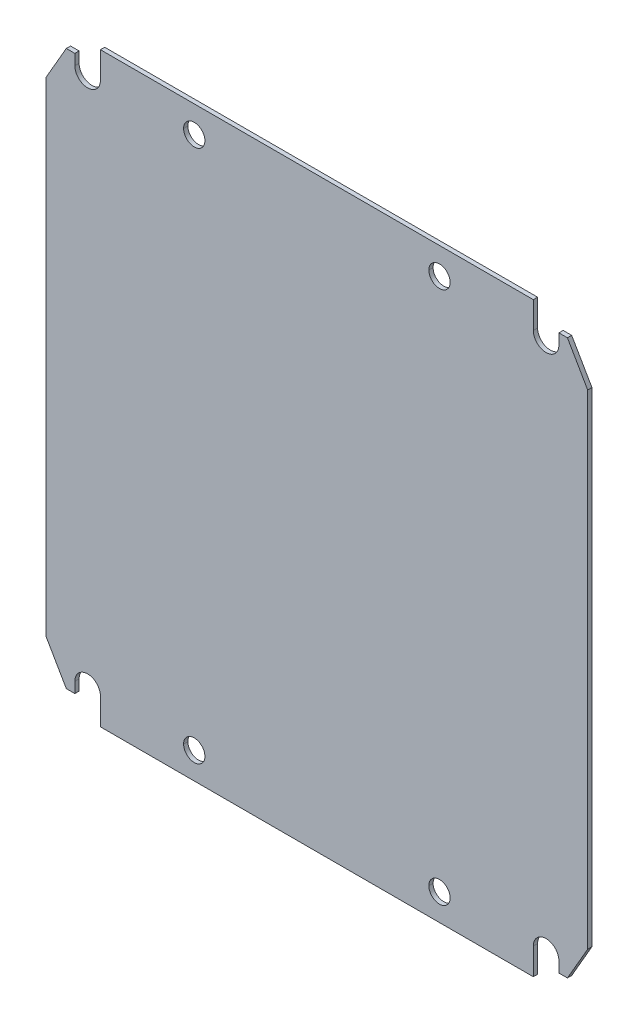
ISO-10303-21;
HEADER;
FILE_DESCRIPTION(('STEP AP214'),'2;1');
FILE_NAME('part.step','',(''),(''),'','','');
FILE_SCHEMA(('AUTOMOTIVE_DESIGN { 1 0 10303 214 1 1 1 1 }'));
ENDSEC;
DATA;
#1=APPLICATION_CONTEXT('core data for automotive mechanical design processes');
#2=APPLICATION_PROTOCOL_DEFINITION('international standard','automotive_design',2000,#1);
#3=PRODUCT_CONTEXT('',#1,'mechanical');
#4=PRODUCT('Part','Part','',(#3));
#5=PRODUCT_RELATED_PRODUCT_CATEGORY('part','',(#4));
#6=PRODUCT_DEFINITION_FORMATION('','',#4);
#7=PRODUCT_DEFINITION_CONTEXT('part definition',#1,'design');
#8=PRODUCT_DEFINITION('design','',#6,#7);
#9=PRODUCT_DEFINITION_SHAPE('','',#8);
#10=(LENGTH_UNIT() NAMED_UNIT(*) SI_UNIT(.MILLI.,.METRE.));
#11=(NAMED_UNIT(*) PLANE_ANGLE_UNIT() SI_UNIT($,.RADIAN.));
#12=(NAMED_UNIT(*) SI_UNIT($,.STERADIAN.) SOLID_ANGLE_UNIT());
#13=UNCERTAINTY_MEASURE_WITH_UNIT(LENGTH_MEASURE(1.E-05),#10,'distance_accuracy_value','');
#14=(GEOMETRIC_REPRESENTATION_CONTEXT(3) GLOBAL_UNCERTAINTY_ASSIGNED_CONTEXT((#13)) GLOBAL_UNIT_ASSIGNED_CONTEXT((#10,
#11,#12)) REPRESENTATION_CONTEXT('',''));
#15=CARTESIAN_POINT('',(0.,0.,0.));
#16=DIRECTION('',(0.,0.,1.));
#17=DIRECTION('',(1.,0.,0.));
#18=AXIS2_PLACEMENT_3D('',#15,#16,#17);
#19=CARTESIAN_POINT('',(-127.,238.5455173281,-2.));
#20=DIRECTION('',(-1.,0.,0.));
#21=DIRECTION('',(0.,0.,1.));
#22=AXIS2_PLACEMENT_3D('',#19,#20,#21);
#23=PLANE('',#22);
#24=DIRECTION('',(0.,-1.,0.));
#25=VECTOR('',#24,1.);
#26=CARTESIAN_POINT('',(-127.,238.5455173281,0.));
#27=LINE('',#26,#25);
#28=CARTESIAN_POINT('',(-127.,238.5455173281,0.));
#29=VERTEX_POINT('',#28);
#30=CARTESIAN_POINT('',(-127.,11.454482671904,0.));
#31=VERTEX_POINT('',#30);
#32=EDGE_CURVE('E11',#29,#31,#27,.T.);
#33=ORIENTED_EDGE('',*,*,#32,.F.);
#34=DIRECTION('',(0.,0.,1.));
#35=VECTOR('',#34,1.);
#36=CARTESIAN_POINT('',(-127.,238.5455173281,-2.));
#37=LINE('',#36,#35);
#38=CARTESIAN_POINT('',(-127.,238.5455173281,-2.));
#39=VERTEX_POINT('',#38);
#40=EDGE_CURVE('E24',#39,#29,#37,.T.);
#41=ORIENTED_EDGE('',*,*,#40,.F.);
#42=DIRECTION('',(0.,-1.,0.));
#43=VECTOR('',#42,1.);
#44=CARTESIAN_POINT('',(-127.,238.5455173281,-2.));
#45=LINE('',#44,#43);
#46=CARTESIAN_POINT('',(-127.,11.454482671904,-2.));
#47=VERTEX_POINT('',#46);
#48=EDGE_CURVE('E616',#39,#47,#45,.T.);
#49=ORIENTED_EDGE('',*,*,#48,.T.);
#50=DIRECTION('',(0.,0.,1.));
#51=VECTOR('',#50,1.);
#52=CARTESIAN_POINT('',(-127.,11.454482671904,-2.));
#53=LINE('',#52,#51);
#54=EDGE_CURVE('E612',#47,#31,#53,.T.);
#55=ORIENTED_EDGE('',*,*,#54,.T.);
#56=EDGE_LOOP('',(#33,#41,#49,#55));
#57=FACE_BOUND('',#56,.T.);
#58=ADVANCED_FACE('F16',(#57),#23,.T.);
#59=CARTESIAN_POINT('',(-127.,11.454482671904,-2.));
#60=DIRECTION('',(-0.866025403784435,-0.500000000000007,0.));
#61=DIRECTION('',(0.500000000000007,-0.866025403784435,0.));
#62=AXIS2_PLACEMENT_3D('',#59,#60,#61);
#63=PLANE('',#62);
#64=DIRECTION('',(0.500000000000007,-0.866025403784434,0.));
#65=VECTOR('',#64,1.);
#66=CARTESIAN_POINT('',(-127.,11.454482671904,0.));
#67=LINE('',#66,#65);
#68=CARTESIAN_POINT('',(-117.5,-5.,0.));
#69=VERTEX_POINT('',#68);
#70=EDGE_CURVE('E607',#31,#69,#67,.T.);
#71=ORIENTED_EDGE('',*,*,#70,.F.);
#72=ORIENTED_EDGE('',*,*,#54,.F.);
#73=DIRECTION('',(0.500000000000007,-0.866025403784434,0.));
#74=VECTOR('',#73,1.);
#75=CARTESIAN_POINT('',(-127.,11.454482671904,-2.));
#76=LINE('',#75,#74);
#77=CARTESIAN_POINT('',(-117.5,-5.,-2.));
#78=VERTEX_POINT('',#77);
#79=EDGE_CURVE('E603',#47,#78,#76,.T.);
#80=ORIENTED_EDGE('',*,*,#79,.T.);
#81=DIRECTION('',(0.,0.,1.));
#82=VECTOR('',#81,1.);
#83=CARTESIAN_POINT('',(-117.5,-5.,-2.));
#84=LINE('',#83,#82);
#85=EDGE_CURVE('E599',#78,#69,#84,.T.);
#86=ORIENTED_EDGE('',*,*,#85,.T.);
#87=EDGE_LOOP('',(#71,#72,#80,#86));
#88=FACE_BOUND('',#87,.T.);
#89=ADVANCED_FACE('F638',(#88),#63,.T.);
#90=CARTESIAN_POINT('',(-117.5,-5.,-2.));
#91=DIRECTION('',(0.,-1.,0.));
#92=DIRECTION('',(0.,0.,-1.));
#93=AXIS2_PLACEMENT_3D('',#90,#91,#92);
#94=PLANE('',#93);
#95=DIRECTION('',(1.,0.,0.));
#96=VECTOR('',#95,1.);
#97=CARTESIAN_POINT('',(-117.5,-5.,0.));
#98=LINE('',#97,#96);
#99=CARTESIAN_POINT('',(-113.5,-5.,0.));
#100=VERTEX_POINT('',#99);
#101=EDGE_CURVE('E594',#69,#100,#98,.T.);
#102=ORIENTED_EDGE('',*,*,#101,.F.);
#103=ORIENTED_EDGE('',*,*,#85,.F.);
#104=DIRECTION('',(1.,0.,0.));
#105=VECTOR('',#104,1.);
#106=CARTESIAN_POINT('',(-117.5,-5.,-2.));
#107=LINE('',#106,#105);
#108=CARTESIAN_POINT('',(-113.5,-5.,-2.));
#109=VERTEX_POINT('',#108);
#110=EDGE_CURVE('E590',#78,#109,#107,.T.);
#111=ORIENTED_EDGE('',*,*,#110,.T.);
#112=DIRECTION('',(0.,0.,1.));
#113=VECTOR('',#112,1.);
#114=CARTESIAN_POINT('',(-113.5,-5.,-2.));
#115=LINE('',#114,#113);
#116=EDGE_CURVE('E586',#109,#100,#115,.T.);
#117=ORIENTED_EDGE('',*,*,#116,.T.);
#118=EDGE_LOOP('',(#102,#103,#111,#117));
#119=FACE_BOUND('',#118,.T.);
#120=ADVANCED_FACE('F738',(#119),#94,.T.);
#121=CARTESIAN_POINT('',(-113.5,-5.,-2.));
#122=DIRECTION('',(1.,0.,0.));
#123=DIRECTION('',(0.,0.,-1.));
#124=AXIS2_PLACEMENT_3D('',#121,#122,#123);
#125=PLANE('',#124);
#126=DIRECTION('',(0.,1.,0.));
#127=VECTOR('',#126,1.);
#128=CARTESIAN_POINT('',(-113.5,-5.,0.));
#129=LINE('',#128,#127);
#130=CARTESIAN_POINT('',(-113.5,0.,0.));
#131=VERTEX_POINT('',#130);
#132=EDGE_CURVE('E581',#100,#131,#129,.T.);
#133=ORIENTED_EDGE('',*,*,#132,.F.);
#134=ORIENTED_EDGE('',*,*,#116,.F.);
#135=DIRECTION('',(0.,1.,0.));
#136=VECTOR('',#135,1.);
#137=CARTESIAN_POINT('',(-113.5,-5.,-2.));
#138=LINE('',#137,#136);
#139=CARTESIAN_POINT('',(-113.5,0.,-2.));
#140=VERTEX_POINT('',#139);
#141=EDGE_CURVE('E577',#109,#140,#138,.T.);
#142=ORIENTED_EDGE('',*,*,#141,.T.);
#143=DIRECTION('',(0.,0.,1.));
#144=VECTOR('',#143,1.);
#145=CARTESIAN_POINT('',(-113.5,0.,-2.));
#146=LINE('',#145,#144);
#147=EDGE_CURVE('E573',#140,#131,#146,.T.);
#148=ORIENTED_EDGE('',*,*,#147,.T.);
#149=EDGE_LOOP('',(#133,#134,#142,#148));
#150=FACE_BOUND('',#149,.T.);
#151=ADVANCED_FACE('F736',(#150),#125,.T.);
#152=CARTESIAN_POINT('',(-107.5,0.,-2.));
#153=DIRECTION('',(0.,0.,1.));
#154=DIRECTION('',(0.,-1.,0.));
#155=AXIS2_PLACEMENT_3D('',#152,#153,#154);
#156=CYLINDRICAL_SURFACE('',#155,6.);
#157=CARTESIAN_POINT('',(-107.5,0.,0.));
#158=DIRECTION('',(0.,0.,1.));
#159=DIRECTION('',(1.,0.,0.));
#160=AXIS2_PLACEMENT_3D('',#157,#158,#159);
#161=CIRCLE('',#160,6.);
#162=CARTESIAN_POINT('',(-101.5,0.,0.));
#163=VERTEX_POINT('',#162);
#164=EDGE_CURVE('E568',#163,#131,#161,.T.);
#165=ORIENTED_EDGE('',*,*,#164,.T.);
#166=ORIENTED_EDGE('',*,*,#147,.F.);
#167=CARTESIAN_POINT('',(-107.5,0.,-2.));
#168=DIRECTION('',(0.,0.,1.));
#169=DIRECTION('',(1.,0.,0.));
#170=AXIS2_PLACEMENT_3D('',#167,#168,#169);
#171=CIRCLE('',#170,6.);
#172=CARTESIAN_POINT('',(-101.5,0.,-2.));
#173=VERTEX_POINT('',#172);
#174=EDGE_CURVE('E563',#173,#140,#171,.T.);
#175=ORIENTED_EDGE('',*,*,#174,.F.);
#176=DIRECTION('',(0.,0.,1.));
#177=VECTOR('',#176,1.);
#178=CARTESIAN_POINT('',(-101.5,0.,-2.));
#179=LINE('',#178,#177);
#180=EDGE_CURVE('E559',#173,#163,#179,.T.);
#181=ORIENTED_EDGE('',*,*,#180,.T.);
#182=EDGE_LOOP('',(#165,#166,#175,#181));
#183=FACE_BOUND('',#182,.T.);
#184=ADVANCED_FACE('F730',(#183),#156,.F.);
#185=CARTESIAN_POINT('',(-101.5,0.,-2.));
#186=DIRECTION('',(-1.,0.,0.));
#187=DIRECTION('',(0.,0.,1.));
#188=AXIS2_PLACEMENT_3D('',#185,#186,#187);
#189=PLANE('',#188);
#190=DIRECTION('',(0.,-1.,0.));
#191=VECTOR('',#190,1.);
#192=CARTESIAN_POINT('',(-101.5,0.,0.));
#193=LINE('',#192,#191);
#194=CARTESIAN_POINT('',(-101.5,-12.5,0.));
#195=VERTEX_POINT('',#194);
#196=EDGE_CURVE('E554',#163,#195,#193,.T.);
#197=ORIENTED_EDGE('',*,*,#196,.F.);
#198=ORIENTED_EDGE('',*,*,#180,.F.);
#199=DIRECTION('',(0.,-1.,0.));
#200=VECTOR('',#199,1.);
#201=CARTESIAN_POINT('',(-101.5,0.,-2.));
#202=LINE('',#201,#200);
#203=CARTESIAN_POINT('',(-101.5,-12.5,-2.));
#204=VERTEX_POINT('',#203);
#205=EDGE_CURVE('E550',#173,#204,#202,.T.);
#206=ORIENTED_EDGE('',*,*,#205,.T.);
#207=DIRECTION('',(0.,0.,1.));
#208=VECTOR('',#207,1.);
#209=CARTESIAN_POINT('',(-101.5,-12.5,-2.));
#210=LINE('',#209,#208);
#211=EDGE_CURVE('E546',#204,#195,#210,.T.);
#212=ORIENTED_EDGE('',*,*,#211,.T.);
#213=EDGE_LOOP('',(#197,#198,#206,#212));
#214=FACE_BOUND('',#213,.T.);
#215=ADVANCED_FACE('F726',(#214),#189,.T.);
#216=CARTESIAN_POINT('',(-101.5,-12.5,-2.));
#217=DIRECTION('',(0.,-1.,0.));
#218=DIRECTION('',(0.,0.,-1.));
#219=AXIS2_PLACEMENT_3D('',#216,#217,#218);
#220=PLANE('',#219);
#221=DIRECTION('',(1.,0.,0.));
#222=VECTOR('',#221,1.);
#223=CARTESIAN_POINT('',(-101.5,-12.5,0.));
#224=LINE('',#223,#222);
#225=CARTESIAN_POINT('',(101.5,-12.5,0.));
#226=VERTEX_POINT('',#225);
#227=EDGE_CURVE('E541',#195,#226,#224,.T.);
#228=ORIENTED_EDGE('',*,*,#227,.F.);
#229=ORIENTED_EDGE('',*,*,#211,.F.);
#230=DIRECTION('',(1.,0.,0.));
#231=VECTOR('',#230,1.);
#232=CARTESIAN_POINT('',(-101.5,-12.5,-2.));
#233=LINE('',#232,#231);
#234=CARTESIAN_POINT('',(101.5,-12.5,-2.));
#235=VERTEX_POINT('',#234);
#236=EDGE_CURVE('E537',#204,#235,#233,.T.);
#237=ORIENTED_EDGE('',*,*,#236,.T.);
#238=DIRECTION('',(0.,0.,1.));
#239=VECTOR('',#238,1.);
#240=CARTESIAN_POINT('',(101.5,-12.5,-2.));
#241=LINE('',#240,#239);
#242=EDGE_CURVE('E533',#235,#226,#241,.T.);
#243=ORIENTED_EDGE('',*,*,#242,.T.);
#244=EDGE_LOOP('',(#228,#229,#237,#243));
#245=FACE_BOUND('',#244,.T.);
#246=ADVANCED_FACE('F723',(#245),#220,.T.);
#247=CARTESIAN_POINT('',(101.5,-12.5,-2.));
#248=DIRECTION('',(1.,0.,0.));
#249=DIRECTION('',(0.,0.,-1.));
#250=AXIS2_PLACEMENT_3D('',#247,#248,#249);
#251=PLANE('',#250);
#252=DIRECTION('',(0.,1.,0.));
#253=VECTOR('',#252,1.);
#254=CARTESIAN_POINT('',(101.5,-12.5,0.));
#255=LINE('',#254,#253);
#256=CARTESIAN_POINT('',(101.5,0.,0.));
#257=VERTEX_POINT('',#256);
#258=EDGE_CURVE('E528',#226,#257,#255,.T.);
#259=ORIENTED_EDGE('',*,*,#258,.F.);
#260=ORIENTED_EDGE('',*,*,#242,.F.);
#261=DIRECTION('',(0.,1.,0.));
#262=VECTOR('',#261,1.);
#263=CARTESIAN_POINT('',(101.5,-12.5,-2.));
#264=LINE('',#263,#262);
#265=CARTESIAN_POINT('',(101.5,0.,-2.));
#266=VERTEX_POINT('',#265);
#267=EDGE_CURVE('E524',#235,#266,#264,.T.);
#268=ORIENTED_EDGE('',*,*,#267,.T.);
#269=DIRECTION('',(0.,0.,1.));
#270=VECTOR('',#269,1.);
#271=CARTESIAN_POINT('',(101.5,0.,-2.));
#272=LINE('',#271,#270);
#273=EDGE_CURVE('E520',#266,#257,#272,.T.);
#274=ORIENTED_EDGE('',*,*,#273,.T.);
#275=EDGE_LOOP('',(#259,#260,#268,#274));
#276=FACE_BOUND('',#275,.T.);
#277=ADVANCED_FACE('F716',(#276),#251,.T.);
#278=CARTESIAN_POINT('',(107.5,0.,-2.));
#279=DIRECTION('',(0.,0.,1.));
#280=DIRECTION('',(0.,-1.,0.));
#281=AXIS2_PLACEMENT_3D('',#278,#279,#280);
#282=CYLINDRICAL_SURFACE('',#281,6.);
#283=CARTESIAN_POINT('',(107.5,0.,0.));
#284=DIRECTION('',(0.,0.,1.));
#285=DIRECTION('',(1.,0.,0.));
#286=AXIS2_PLACEMENT_3D('',#283,#284,#285);
#287=CIRCLE('',#286,6.);
#288=CARTESIAN_POINT('',(113.5,0.,0.));
#289=VERTEX_POINT('',#288);
#290=EDGE_CURVE('E515',#289,#257,#287,.T.);
#291=ORIENTED_EDGE('',*,*,#290,.T.);
#292=ORIENTED_EDGE('',*,*,#273,.F.);
#293=CARTESIAN_POINT('',(107.5,0.,-2.));
#294=DIRECTION('',(0.,0.,1.));
#295=DIRECTION('',(1.,0.,0.));
#296=AXIS2_PLACEMENT_3D('',#293,#294,#295);
#297=CIRCLE('',#296,6.);
#298=CARTESIAN_POINT('',(113.5,0.,-2.));
#299=VERTEX_POINT('',#298);
#300=EDGE_CURVE('E510',#299,#266,#297,.T.);
#301=ORIENTED_EDGE('',*,*,#300,.F.);
#302=DIRECTION('',(0.,0.,1.));
#303=VECTOR('',#302,1.);
#304=CARTESIAN_POINT('',(113.5,0.,-2.));
#305=LINE('',#304,#303);
#306=EDGE_CURVE('E506',#299,#289,#305,.T.);
#307=ORIENTED_EDGE('',*,*,#306,.T.);
#308=EDGE_LOOP('',(#291,#292,#301,#307));
#309=FACE_BOUND('',#308,.T.);
#310=ADVANCED_FACE('F713',(#309),#282,.F.);
#311=CARTESIAN_POINT('',(113.5,0.,-2.));
#312=DIRECTION('',(-1.,0.,0.));
#313=DIRECTION('',(0.,0.,1.));
#314=AXIS2_PLACEMENT_3D('',#311,#312,#313);
#315=PLANE('',#314);
#316=DIRECTION('',(0.,-1.,0.));
#317=VECTOR('',#316,1.);
#318=CARTESIAN_POINT('',(113.5,0.,0.));
#319=LINE('',#318,#317);
#320=CARTESIAN_POINT('',(113.5,-5.,0.));
#321=VERTEX_POINT('',#320);
#322=EDGE_CURVE('E501',#289,#321,#319,.T.);
#323=ORIENTED_EDGE('',*,*,#322,.F.);
#324=ORIENTED_EDGE('',*,*,#306,.F.);
#325=DIRECTION('',(0.,-1.,0.));
#326=VECTOR('',#325,1.);
#327=CARTESIAN_POINT('',(113.5,0.,-2.));
#328=LINE('',#327,#326);
#329=CARTESIAN_POINT('',(113.5,-5.,-2.));
#330=VERTEX_POINT('',#329);
#331=EDGE_CURVE('E497',#299,#330,#328,.T.);
#332=ORIENTED_EDGE('',*,*,#331,.T.);
#333=DIRECTION('',(0.,0.,1.));
#334=VECTOR('',#333,1.);
#335=CARTESIAN_POINT('',(113.5,-5.,-2.));
#336=LINE('',#335,#334);
#337=EDGE_CURVE('E493',#330,#321,#336,.T.);
#338=ORIENTED_EDGE('',*,*,#337,.T.);
#339=EDGE_LOOP('',(#323,#324,#332,#338));
#340=FACE_BOUND('',#339,.T.);
#341=ADVANCED_FACE('F710',(#340),#315,.T.);
#342=CARTESIAN_POINT('',(113.5,-5.,-2.));
#343=DIRECTION('',(0.,-1.,0.));
#344=DIRECTION('',(0.,0.,-1.));
#345=AXIS2_PLACEMENT_3D('',#342,#343,#344);
#346=PLANE('',#345);
#347=DIRECTION('',(1.,0.,0.));
#348=VECTOR('',#347,1.);
#349=CARTESIAN_POINT('',(113.5,-5.,0.));
#350=LINE('',#349,#348);
#351=CARTESIAN_POINT('',(117.5,-5.,0.));
#352=VERTEX_POINT('',#351);
#353=EDGE_CURVE('E488',#321,#352,#350,.T.);
#354=ORIENTED_EDGE('',*,*,#353,.F.);
#355=ORIENTED_EDGE('',*,*,#337,.F.);
#356=DIRECTION('',(1.,0.,0.));
#357=VECTOR('',#356,1.);
#358=CARTESIAN_POINT('',(113.5,-5.,-2.));
#359=LINE('',#358,#357);
#360=CARTESIAN_POINT('',(117.5,-5.,-2.));
#361=VERTEX_POINT('',#360);
#362=EDGE_CURVE('E484',#330,#361,#359,.T.);
#363=ORIENTED_EDGE('',*,*,#362,.T.);
#364=DIRECTION('',(0.,0.,1.));
#365=VECTOR('',#364,1.);
#366=CARTESIAN_POINT('',(117.5,-5.,-2.));
#367=LINE('',#366,#365);
#368=EDGE_CURVE('E480',#361,#352,#367,.T.);
#369=ORIENTED_EDGE('',*,*,#368,.T.);
#370=EDGE_LOOP('',(#354,#355,#363,#369));
#371=FACE_BOUND('',#370,.T.);
#372=ADVANCED_FACE('F702',(#371),#346,.T.);
#373=CARTESIAN_POINT('',(117.5,-5.,-2.));
#374=DIRECTION('',(0.866025403784435,-0.500000000000007,0.));
#375=DIRECTION('',(0.500000000000007,0.866025403784435,0.));
#376=AXIS2_PLACEMENT_3D('',#373,#374,#375);
#377=PLANE('',#376);
#378=DIRECTION('',(0.500000000000007,0.866025403784434,0.));
#379=VECTOR('',#378,1.);
#380=CARTESIAN_POINT('',(117.5,-5.,0.));
#381=LINE('',#380,#379);
#382=CARTESIAN_POINT('',(127.,11.454482671904,0.));
#383=VERTEX_POINT('',#382);
#384=EDGE_CURVE('E475',#352,#383,#381,.T.);
#385=ORIENTED_EDGE('',*,*,#384,.F.);
#386=ORIENTED_EDGE('',*,*,#368,.F.);
#387=DIRECTION('',(0.500000000000007,0.866025403784434,0.));
#388=VECTOR('',#387,1.);
#389=CARTESIAN_POINT('',(117.5,-5.,-2.));
#390=LINE('',#389,#388);
#391=CARTESIAN_POINT('',(127.,11.454482671904,-2.));
#392=VERTEX_POINT('',#391);
#393=EDGE_CURVE('E471',#361,#392,#390,.T.);
#394=ORIENTED_EDGE('',*,*,#393,.T.);
#395=DIRECTION('',(0.,0.,1.));
#396=VECTOR('',#395,1.);
#397=CARTESIAN_POINT('',(127.,11.454482671904,-2.));
#398=LINE('',#397,#396);
#399=EDGE_CURVE('E467',#392,#383,#398,.T.);
#400=ORIENTED_EDGE('',*,*,#399,.T.);
#401=EDGE_LOOP('',(#385,#386,#394,#400));
#402=FACE_BOUND('',#401,.T.);
#403=ADVANCED_FACE('F699',(#402),#377,.T.);
#404=CARTESIAN_POINT('',(127.,11.454482671904,-2.));
#405=DIRECTION('',(1.,0.,0.));
#406=DIRECTION('',(0.,0.,-1.));
#407=AXIS2_PLACEMENT_3D('',#404,#405,#406);
#408=PLANE('',#407);
#409=DIRECTION('',(0.,1.,0.));
#410=VECTOR('',#409,1.);
#411=CARTESIAN_POINT('',(127.,11.454482671904,0.));
#412=LINE('',#411,#410);
#413=CARTESIAN_POINT('',(127.,238.5455173281,0.));
#414=VERTEX_POINT('',#413);
#415=EDGE_CURVE('E462',#383,#414,#412,.T.);
#416=ORIENTED_EDGE('',*,*,#415,.F.);
#417=ORIENTED_EDGE('',*,*,#399,.F.);
#418=DIRECTION('',(0.,1.,0.));
#419=VECTOR('',#418,1.);
#420=CARTESIAN_POINT('',(127.,11.454482671904,-2.));
#421=LINE('',#420,#419);
#422=CARTESIAN_POINT('',(127.,238.5455173281,-2.));
#423=VERTEX_POINT('',#422);
#424=EDGE_CURVE('E458',#392,#423,#421,.T.);
#425=ORIENTED_EDGE('',*,*,#424,.T.);
#426=DIRECTION('',(0.,0.,1.));
#427=VECTOR('',#426,1.);
#428=CARTESIAN_POINT('',(127.,238.5455173281,-2.));
#429=LINE('',#428,#427);
#430=EDGE_CURVE('E454',#423,#414,#429,.T.);
#431=ORIENTED_EDGE('',*,*,#430,.T.);
#432=EDGE_LOOP('',(#416,#417,#425,#431));
#433=FACE_BOUND('',#432,.T.);
#434=ADVANCED_FACE('F696',(#433),#408,.T.);
#435=CARTESIAN_POINT('',(127.,238.5455173281,-2.));
#436=DIRECTION('',(0.866025403784382,0.500000000000099,0.));
#437=DIRECTION('',(-0.500000000000099,0.866025403784382,0.));
#438=AXIS2_PLACEMENT_3D('',#435,#436,#437);
#439=PLANE('',#438);
#440=DIRECTION('',(-0.500000000000099,0.866025403784382,0.));
#441=VECTOR('',#440,1.);
#442=CARTESIAN_POINT('',(127.,238.5455173281,0.));
#443=LINE('',#442,#441);
#444=CARTESIAN_POINT('',(117.5,255.,0.));
#445=VERTEX_POINT('',#444);
#446=EDGE_CURVE('E449',#414,#445,#443,.T.);
#447=ORIENTED_EDGE('',*,*,#446,.F.);
#448=ORIENTED_EDGE('',*,*,#430,.F.);
#449=DIRECTION('',(-0.500000000000099,0.866025403784382,0.));
#450=VECTOR('',#449,1.);
#451=CARTESIAN_POINT('',(127.,238.5455173281,-2.));
#452=LINE('',#451,#450);
#453=CARTESIAN_POINT('',(117.5,255.,-2.));
#454=VERTEX_POINT('',#453);
#455=EDGE_CURVE('E445',#423,#454,#452,.T.);
#456=ORIENTED_EDGE('',*,*,#455,.T.);
#457=DIRECTION('',(0.,0.,1.));
#458=VECTOR('',#457,1.);
#459=CARTESIAN_POINT('',(117.5,255.,-2.));
#460=LINE('',#459,#458);
#461=EDGE_CURVE('E441',#454,#445,#460,.T.);
#462=ORIENTED_EDGE('',*,*,#461,.T.);
#463=EDGE_LOOP('',(#447,#448,#456,#462));
#464=FACE_BOUND('',#463,.T.);
#465=ADVANCED_FACE('F687',(#464),#439,.T.);
#466=CARTESIAN_POINT('',(117.5,255.,-2.));
#467=DIRECTION('',(0.,1.,0.));
#468=DIRECTION('',(0.,0.,1.));
#469=AXIS2_PLACEMENT_3D('',#466,#467,#468);
#470=PLANE('',#469);
#471=DIRECTION('',(-1.,0.,0.));
#472=VECTOR('',#471,1.);
#473=CARTESIAN_POINT('',(117.5,255.,0.));
#474=LINE('',#473,#472);
#475=CARTESIAN_POINT('',(113.5,255.,0.));
#476=VERTEX_POINT('',#475);
#477=EDGE_CURVE('E436',#445,#476,#474,.T.);
#478=ORIENTED_EDGE('',*,*,#477,.F.);
#479=ORIENTED_EDGE('',*,*,#461,.F.);
#480=DIRECTION('',(-1.,0.,0.));
#481=VECTOR('',#480,1.);
#482=CARTESIAN_POINT('',(117.5,255.,-2.));
#483=LINE('',#482,#481);
#484=CARTESIAN_POINT('',(113.5,255.,-2.));
#485=VERTEX_POINT('',#484);
#486=EDGE_CURVE('E432',#454,#485,#483,.T.);
#487=ORIENTED_EDGE('',*,*,#486,.T.);
#488=DIRECTION('',(0.,0.,1.));
#489=VECTOR('',#488,1.);
#490=CARTESIAN_POINT('',(113.5,255.,-2.));
#491=LINE('',#490,#489);
#492=EDGE_CURVE('E428',#485,#476,#491,.T.);
#493=ORIENTED_EDGE('',*,*,#492,.T.);
#494=EDGE_LOOP('',(#478,#479,#487,#493));
#495=FACE_BOUND('',#494,.T.);
#496=ADVANCED_FACE('F684',(#495),#470,.T.);
#497=CARTESIAN_POINT('',(113.5,255.,-2.));
#498=DIRECTION('',(-1.,0.,0.));
#499=DIRECTION('',(0.,0.,1.));
#500=AXIS2_PLACEMENT_3D('',#497,#498,#499);
#501=PLANE('',#500);
#502=DIRECTION('',(0.,-1.,0.));
#503=VECTOR('',#502,1.);
#504=CARTESIAN_POINT('',(113.5,255.,0.));
#505=LINE('',#504,#503);
#506=CARTESIAN_POINT('',(113.5,250.,0.));
#507=VERTEX_POINT('',#506);
#508=EDGE_CURVE('E423',#476,#507,#505,.T.);
#509=ORIENTED_EDGE('',*,*,#508,.F.);
#510=ORIENTED_EDGE('',*,*,#492,.F.);
#511=DIRECTION('',(0.,-1.,0.));
#512=VECTOR('',#511,1.);
#513=CARTESIAN_POINT('',(113.5,255.,-2.));
#514=LINE('',#513,#512);
#515=CARTESIAN_POINT('',(113.5,250.,-2.));
#516=VERTEX_POINT('',#515);
#517=EDGE_CURVE('E419',#485,#516,#514,.T.);
#518=ORIENTED_EDGE('',*,*,#517,.T.);
#519=DIRECTION('',(0.,0.,1.));
#520=VECTOR('',#519,1.);
#521=CARTESIAN_POINT('',(113.5,250.,-2.));
#522=LINE('',#521,#520);
#523=EDGE_CURVE('E415',#516,#507,#522,.T.);
#524=ORIENTED_EDGE('',*,*,#523,.T.);
#525=EDGE_LOOP('',(#509,#510,#518,#524));
#526=FACE_BOUND('',#525,.T.);
#527=ADVANCED_FACE('F681',(#526),#501,.T.);
#528=CARTESIAN_POINT('',(107.5,250.,-2.));
#529=DIRECTION('',(0.,0.,1.));
#530=DIRECTION('',(0.,1.,0.));
#531=AXIS2_PLACEMENT_3D('',#528,#529,#530);
#532=CYLINDRICAL_SURFACE('',#531,6.);
#533=CARTESIAN_POINT('',(107.5,250.,0.));
#534=DIRECTION('',(0.,0.,1.));
#535=DIRECTION('',(1.,0.,0.));
#536=AXIS2_PLACEMENT_3D('',#533,#534,#535);
#537=CIRCLE('',#536,6.);
#538=CARTESIAN_POINT('',(101.5,250.,0.));
#539=VERTEX_POINT('',#538);
#540=EDGE_CURVE('E410',#539,#507,#537,.T.);
#541=ORIENTED_EDGE('',*,*,#540,.T.);
#542=ORIENTED_EDGE('',*,*,#523,.F.);
#543=CARTESIAN_POINT('',(107.5,250.,-2.));
#544=DIRECTION('',(0.,0.,1.));
#545=DIRECTION('',(1.,0.,0.));
#546=AXIS2_PLACEMENT_3D('',#543,#544,#545);
#547=CIRCLE('',#546,6.);
#548=CARTESIAN_POINT('',(101.5,250.,-2.));
#549=VERTEX_POINT('',#548);
#550=EDGE_CURVE('E405',#549,#516,#547,.T.);
#551=ORIENTED_EDGE('',*,*,#550,.F.);
#552=DIRECTION('',(0.,0.,1.));
#553=VECTOR('',#552,1.);
#554=CARTESIAN_POINT('',(101.5,250.,-2.));
#555=LINE('',#554,#553);
#556=EDGE_CURVE('E401',#549,#539,#555,.T.);
#557=ORIENTED_EDGE('',*,*,#556,.T.);
#558=EDGE_LOOP('',(#541,#542,#551,#557));
#559=FACE_BOUND('',#558,.T.);
#560=ADVANCED_FACE('F672',(#559),#532,.F.);
#561=CARTESIAN_POINT('',(101.5,250.,-2.));
#562=DIRECTION('',(1.,0.,0.));
#563=DIRECTION('',(0.,0.,-1.));
#564=AXIS2_PLACEMENT_3D('',#561,#562,#563);
#565=PLANE('',#564);
#566=DIRECTION('',(0.,1.,0.));
#567=VECTOR('',#566,1.);
#568=CARTESIAN_POINT('',(101.5,250.,0.));
#569=LINE('',#568,#567);
#570=CARTESIAN_POINT('',(101.5,262.5,0.));
#571=VERTEX_POINT('',#570);
#572=EDGE_CURVE('E396',#539,#571,#569,.T.);
#573=ORIENTED_EDGE('',*,*,#572,.F.);
#574=ORIENTED_EDGE('',*,*,#556,.F.);
#575=DIRECTION('',(0.,1.,0.));
#576=VECTOR('',#575,1.);
#577=CARTESIAN_POINT('',(101.5,250.,-2.));
#578=LINE('',#577,#576);
#579=CARTESIAN_POINT('',(101.5,262.5,-2.));
#580=VERTEX_POINT('',#579);
#581=EDGE_CURVE('E392',#549,#580,#578,.T.);
#582=ORIENTED_EDGE('',*,*,#581,.T.);
#583=DIRECTION('',(0.,0.,1.));
#584=VECTOR('',#583,1.);
#585=CARTESIAN_POINT('',(101.5,262.5,-2.));
#586=LINE('',#585,#584);
#587=EDGE_CURVE('E388',#580,#571,#586,.T.);
#588=ORIENTED_EDGE('',*,*,#587,.T.);
#589=EDGE_LOOP('',(#573,#574,#582,#588));
#590=FACE_BOUND('',#589,.T.);
#591=ADVANCED_FACE('F668',(#590),#565,.T.);
#592=CARTESIAN_POINT('',(101.5,262.5,-2.));
#593=DIRECTION('',(0.,1.,0.));
#594=DIRECTION('',(0.,0.,1.));
#595=AXIS2_PLACEMENT_3D('',#592,#593,#594);
#596=PLANE('',#595);
#597=DIRECTION('',(-1.,0.,0.));
#598=VECTOR('',#597,1.);
#599=CARTESIAN_POINT('',(101.5,262.5,0.));
#600=LINE('',#599,#598);
#601=CARTESIAN_POINT('',(-101.5,262.5,0.));
#602=VERTEX_POINT('',#601);
#603=EDGE_CURVE('E383',#571,#602,#600,.T.);
#604=ORIENTED_EDGE('',*,*,#603,.F.);
#605=ORIENTED_EDGE('',*,*,#587,.F.);
#606=DIRECTION('',(-1.,0.,0.));
#607=VECTOR('',#606,1.);
#608=CARTESIAN_POINT('',(101.5,262.5,-2.));
#609=LINE('',#608,#607);
#610=CARTESIAN_POINT('',(-101.5,262.5,-2.));
#611=VERTEX_POINT('',#610);
#612=EDGE_CURVE('E379',#580,#611,#609,.T.);
#613=ORIENTED_EDGE('',*,*,#612,.T.);
#614=DIRECTION('',(0.,0.,1.));
#615=VECTOR('',#614,1.);
#616=CARTESIAN_POINT('',(-101.5,262.5,-2.));
#617=LINE('',#616,#615);
#618=EDGE_CURVE('E375',#611,#602,#617,.T.);
#619=ORIENTED_EDGE('',*,*,#618,.T.);
#620=EDGE_LOOP('',(#604,#605,#613,#619));
#621=FACE_BOUND('',#620,.T.);
#622=ADVANCED_FACE('F665',(#621),#596,.T.);
#623=CARTESIAN_POINT('',(-101.5,262.5,-2.));
#624=DIRECTION('',(-1.,0.,0.));
#625=DIRECTION('',(0.,0.,1.));
#626=AXIS2_PLACEMENT_3D('',#623,#624,#625);
#627=PLANE('',#626);
#628=DIRECTION('',(0.,-1.,0.));
#629=VECTOR('',#628,1.);
#630=CARTESIAN_POINT('',(-101.5,262.5,0.));
#631=LINE('',#630,#629);
#632=CARTESIAN_POINT('',(-101.5,250.,0.));
#633=VERTEX_POINT('',#632);
#634=EDGE_CURVE('E370',#602,#633,#631,.T.);
#635=ORIENTED_EDGE('',*,*,#634,.F.);
#636=ORIENTED_EDGE('',*,*,#618,.F.);
#637=DIRECTION('',(0.,-1.,0.));
#638=VECTOR('',#637,1.);
#639=CARTESIAN_POINT('',(-101.5,262.5,-2.));
#640=LINE('',#639,#638);
#641=CARTESIAN_POINT('',(-101.5,250.,-2.));
#642=VERTEX_POINT('',#641);
#643=EDGE_CURVE('E366',#611,#642,#640,.T.);
#644=ORIENTED_EDGE('',*,*,#643,.T.);
#645=DIRECTION('',(0.,0.,1.));
#646=VECTOR('',#645,1.);
#647=CARTESIAN_POINT('',(-101.5,250.,-2.));
#648=LINE('',#647,#646);
#649=EDGE_CURVE('E362',#642,#633,#648,.T.);
#650=ORIENTED_EDGE('',*,*,#649,.T.);
#651=EDGE_LOOP('',(#635,#636,#644,#650));
#652=FACE_BOUND('',#651,.T.);
#653=ADVANCED_FACE('F658',(#652),#627,.T.);
#654=CARTESIAN_POINT('',(-107.5,250.,-2.));
#655=DIRECTION('',(0.,0.,1.));
#656=DIRECTION('',(0.,1.,0.));
#657=AXIS2_PLACEMENT_3D('',#654,#655,#656);
#658=CYLINDRICAL_SURFACE('',#657,6.);
#659=CARTESIAN_POINT('',(-107.5,250.,0.));
#660=DIRECTION('',(0.,0.,1.));
#661=DIRECTION('',(1.,0.,0.));
#662=AXIS2_PLACEMENT_3D('',#659,#660,#661);
#663=CIRCLE('',#662,6.);
#664=CARTESIAN_POINT('',(-113.5,250.,0.));
#665=VERTEX_POINT('',#664);
#666=EDGE_CURVE('E357',#665,#633,#663,.T.);
#667=ORIENTED_EDGE('',*,*,#666,.T.);
#668=ORIENTED_EDGE('',*,*,#649,.F.);
#669=CARTESIAN_POINT('',(-107.5,250.,-2.));
#670=DIRECTION('',(0.,0.,1.));
#671=DIRECTION('',(1.,0.,0.));
#672=AXIS2_PLACEMENT_3D('',#669,#670,#671);
#673=CIRCLE('',#672,6.);
#674=CARTESIAN_POINT('',(-113.5,250.,-2.));
#675=VERTEX_POINT('',#674);
#676=EDGE_CURVE('E352',#675,#642,#673,.T.);
#677=ORIENTED_EDGE('',*,*,#676,.F.);
#678=DIRECTION('',(0.,0.,1.));
#679=VECTOR('',#678,1.);
#680=CARTESIAN_POINT('',(-113.5,250.,-2.));
#681=LINE('',#680,#679);
#682=EDGE_CURVE('E348',#675,#665,#681,.T.);
#683=ORIENTED_EDGE('',*,*,#682,.T.);
#684=EDGE_LOOP('',(#667,#668,#677,#683));
#685=FACE_BOUND('',#684,.T.);
#686=ADVANCED_FACE('F655',(#685),#658,.F.);
#687=CARTESIAN_POINT('',(-113.5,250.,-2.));
#688=DIRECTION('',(1.,0.,0.));
#689=DIRECTION('',(0.,0.,-1.));
#690=AXIS2_PLACEMENT_3D('',#687,#688,#689);
#691=PLANE('',#690);
#692=DIRECTION('',(0.,1.,0.));
#693=VECTOR('',#692,1.);
#694=CARTESIAN_POINT('',(-113.5,250.,0.));
#695=LINE('',#694,#693);
#696=CARTESIAN_POINT('',(-113.5,255.,0.));
#697=VERTEX_POINT('',#696);
#698=EDGE_CURVE('E343',#665,#697,#695,.T.);
#699=ORIENTED_EDGE('',*,*,#698,.F.);
#700=ORIENTED_EDGE('',*,*,#682,.F.);
#701=DIRECTION('',(0.,1.,0.));
#702=VECTOR('',#701,1.);
#703=CARTESIAN_POINT('',(-113.5,250.,-2.));
#704=LINE('',#703,#702);
#705=CARTESIAN_POINT('',(-113.5,255.,-2.));
#706=VERTEX_POINT('',#705);
#707=EDGE_CURVE('E339',#675,#706,#704,.T.);
#708=ORIENTED_EDGE('',*,*,#707,.T.);
#709=DIRECTION('',(0.,0.,1.));
#710=VECTOR('',#709,1.);
#711=CARTESIAN_POINT('',(-113.5,255.,-2.));
#712=LINE('',#711,#710);
#713=EDGE_CURVE('E335',#706,#697,#712,.T.);
#714=ORIENTED_EDGE('',*,*,#713,.T.);
#715=EDGE_LOOP('',(#699,#700,#708,#714));
#716=FACE_BOUND('',#715,.T.);
#717=ADVANCED_FACE('F653',(#716),#691,.T.);
#718=CARTESIAN_POINT('',(-113.5,255.,-2.));
#719=DIRECTION('',(0.,1.,0.));
#720=DIRECTION('',(0.,0.,1.));
#721=AXIS2_PLACEMENT_3D('',#718,#719,#720);
#722=PLANE('',#721);
#723=DIRECTION('',(-1.,0.,0.));
#724=VECTOR('',#723,1.);
#725=CARTESIAN_POINT('',(-113.5,255.,0.));
#726=LINE('',#725,#724);
#727=CARTESIAN_POINT('',(-117.5,255.,0.));
#728=VERTEX_POINT('',#727);
#729=EDGE_CURVE('E330',#697,#728,#726,.T.);
#730=ORIENTED_EDGE('',*,*,#729,.F.);
#731=ORIENTED_EDGE('',*,*,#713,.F.);
#732=DIRECTION('',(-1.,0.,0.));
#733=VECTOR('',#732,1.);
#734=CARTESIAN_POINT('',(-113.5,255.,-2.));
#735=LINE('',#734,#733);
#736=CARTESIAN_POINT('',(-117.5,255.,-2.));
#737=VERTEX_POINT('',#736);
#738=EDGE_CURVE('E326',#706,#737,#735,.T.);
#739=ORIENTED_EDGE('',*,*,#738,.T.);
#740=DIRECTION('',(0.,0.,1.));
#741=VECTOR('',#740,1.);
#742=CARTESIAN_POINT('',(-117.5,255.,-2.));
#743=LINE('',#742,#741);
#744=EDGE_CURVE('E322',#737,#728,#743,.T.);
#745=ORIENTED_EDGE('',*,*,#744,.T.);
#746=EDGE_LOOP('',(#730,#731,#739,#745));
#747=FACE_BOUND('',#746,.T.);
#748=ADVANCED_FACE('F647',(#747),#722,.T.);
#749=CARTESIAN_POINT('',(-117.5,255.,-2.));
#750=DIRECTION('',(-0.866025403784382,0.500000000000099,0.));
#751=DIRECTION('',(-0.500000000000099,-0.866025403784382,0.));
#752=AXIS2_PLACEMENT_3D('',#749,#750,#751);
#753=PLANE('',#752);
#754=DIRECTION('',(-0.500000000000099,-0.866025403784382,0.));
#755=VECTOR('',#754,1.);
#756=CARTESIAN_POINT('',(-117.5,255.,0.));
#757=LINE('',#756,#755);
#758=EDGE_CURVE('E318',#728,#29,#757,.T.);
#759=ORIENTED_EDGE('',*,*,#758,.F.);
#760=ORIENTED_EDGE('',*,*,#744,.F.);
#761=DIRECTION('',(-0.500000000000099,-0.866025403784382,0.));
#762=VECTOR('',#761,1.);
#763=CARTESIAN_POINT('',(-117.5,255.,-2.));
#764=LINE('',#763,#762);
#765=EDGE_CURVE('E314',#737,#39,#764,.T.);
#766=ORIENTED_EDGE('',*,*,#765,.T.);
#767=ORIENTED_EDGE('',*,*,#40,.T.);
#768=EDGE_LOOP('',(#759,#760,#766,#767));
#769=FACE_BOUND('',#768,.T.);
#770=ADVANCED_FACE('F626',(#769),#753,.T.);
#771=CARTESIAN_POINT('',(-107.5,0.,-2.));
#772=DIRECTION('',(0.,0.,1.));
#773=DIRECTION('',(1.,0.,0.));
#774=AXIS2_PLACEMENT_3D('',#771,#772,#773);
#775=PLANE('',#774);
#776=CARTESIAN_POINT('',(-57.5,250.,-2.));
#777=DIRECTION('',(0.,0.,1.));
#778=DIRECTION('',(1.,0.,0.));
#779=AXIS2_PLACEMENT_3D('',#776,#777,#778);
#780=CIRCLE('',#779,5.);
#781=CARTESIAN_POINT('',(-52.5,250.,-2.));
#782=VERTEX_POINT('',#781);
#783=CARTESIAN_POINT('',(-62.5,250.,-2.));
#784=VERTEX_POINT('',#783);
#785=EDGE_CURVE('E310',#782,#784,#780,.T.);
#786=ORIENTED_EDGE('',*,*,#785,.T.);
#787=CARTESIAN_POINT('',(-57.5,250.,-2.));
#788=DIRECTION('',(0.,0.,1.));
#789=DIRECTION('',(1.,0.,0.));
#790=AXIS2_PLACEMENT_3D('',#787,#788,#789);
#791=CIRCLE('',#790,5.);
#792=EDGE_CURVE('E306',#784,#782,#791,.T.);
#793=ORIENTED_EDGE('',*,*,#792,.T.);
#794=EDGE_LOOP('',(#786,#793));
#795=FACE_BOUND('',#794,.T.);
#796=CARTESIAN_POINT('',(-57.5,0.,-2.));
#797=DIRECTION('',(0.,0.,1.));
#798=DIRECTION('',(1.,0.,0.));
#799=AXIS2_PLACEMENT_3D('',#796,#797,#798);
#800=CIRCLE('',#799,5.);
#801=CARTESIAN_POINT('',(-52.5,0.,-2.));
#802=VERTEX_POINT('',#801);
#803=CARTESIAN_POINT('',(-62.5,0.,-2.));
#804=VERTEX_POINT('',#803);
#805=EDGE_CURVE('E302',#802,#804,#800,.T.);
#806=ORIENTED_EDGE('',*,*,#805,.T.);
#807=CARTESIAN_POINT('',(-57.5,0.,-2.));
#808=DIRECTION('',(0.,0.,1.));
#809=DIRECTION('',(1.,0.,0.));
#810=AXIS2_PLACEMENT_3D('',#807,#808,#809);
#811=CIRCLE('',#810,5.);
#812=EDGE_CURVE('E298',#804,#802,#811,.T.);
#813=ORIENTED_EDGE('',*,*,#812,.T.);
#814=EDGE_LOOP('',(#806,#813));
#815=FACE_BOUND('',#814,.T.);
#816=CARTESIAN_POINT('',(57.5,250.,-2.));
#817=DIRECTION('',(0.,0.,1.));
#818=DIRECTION('',(1.,0.,0.));
#819=AXIS2_PLACEMENT_3D('',#816,#817,#818);
#820=CIRCLE('',#819,5.);
#821=CARTESIAN_POINT('',(62.5,250.,-2.));
#822=VERTEX_POINT('',#821);
#823=CARTESIAN_POINT('',(52.5,250.,-2.));
#824=VERTEX_POINT('',#823);
#825=EDGE_CURVE('E235',#822,#824,#820,.T.);
#826=ORIENTED_EDGE('',*,*,#825,.T.);
#827=CARTESIAN_POINT('',(57.5,250.,-2.));
#828=DIRECTION('',(0.,0.,1.));
#829=DIRECTION('',(1.,0.,0.));
#830=AXIS2_PLACEMENT_3D('',#827,#828,#829);
#831=CIRCLE('',#830,5.);
#832=EDGE_CURVE('E291',#824,#822,#831,.T.);
#833=ORIENTED_EDGE('',*,*,#832,.T.);
#834=EDGE_LOOP('',(#826,#833));
#835=FACE_BOUND('',#834,.T.);
#836=CARTESIAN_POINT('',(57.5,0.,-2.));
#837=DIRECTION('',(0.,0.,1.));
#838=DIRECTION('',(1.,0.,0.));
#839=AXIS2_PLACEMENT_3D('',#836,#837,#838);
#840=CIRCLE('',#839,5.);
#841=CARTESIAN_POINT('',(62.5,0.,-2.));
#842=VERTEX_POINT('',#841);
#843=CARTESIAN_POINT('',(52.5,0.,-2.));
#844=VERTEX_POINT('',#843);
#845=EDGE_CURVE('E287',#842,#844,#840,.T.);
#846=ORIENTED_EDGE('',*,*,#845,.T.);
#847=CARTESIAN_POINT('',(57.5,0.,-2.));
#848=DIRECTION('',(0.,0.,1.));
#849=DIRECTION('',(1.,0.,0.));
#850=AXIS2_PLACEMENT_3D('',#847,#848,#849);
#851=CIRCLE('',#850,5.);
#852=EDGE_CURVE('E283',#844,#842,#851,.T.);
#853=ORIENTED_EDGE('',*,*,#852,.T.);
#854=EDGE_LOOP('',(#846,#853));
#855=FACE_BOUND('',#854,.T.);
#856=ORIENTED_EDGE('',*,*,#48,.F.);
#857=ORIENTED_EDGE('',*,*,#765,.F.);
#858=ORIENTED_EDGE('',*,*,#738,.F.);
#859=ORIENTED_EDGE('',*,*,#707,.F.);
#860=ORIENTED_EDGE('',*,*,#676,.T.);
#861=ORIENTED_EDGE('',*,*,#643,.F.);
#862=ORIENTED_EDGE('',*,*,#612,.F.);
#863=ORIENTED_EDGE('',*,*,#581,.F.);
#864=ORIENTED_EDGE('',*,*,#550,.T.);
#865=ORIENTED_EDGE('',*,*,#517,.F.);
#866=ORIENTED_EDGE('',*,*,#486,.F.);
#867=ORIENTED_EDGE('',*,*,#455,.F.);
#868=ORIENTED_EDGE('',*,*,#424,.F.);
#869=ORIENTED_EDGE('',*,*,#393,.F.);
#870=ORIENTED_EDGE('',*,*,#362,.F.);
#871=ORIENTED_EDGE('',*,*,#331,.F.);
#872=ORIENTED_EDGE('',*,*,#300,.T.);
#873=ORIENTED_EDGE('',*,*,#267,.F.);
#874=ORIENTED_EDGE('',*,*,#236,.F.);
#875=ORIENTED_EDGE('',*,*,#205,.F.);
#876=ORIENTED_EDGE('',*,*,#174,.T.);
#877=ORIENTED_EDGE('',*,*,#141,.F.);
#878=ORIENTED_EDGE('',*,*,#110,.F.);
#879=ORIENTED_EDGE('',*,*,#79,.F.);
#880=EDGE_LOOP('',(#856,#857,#858,#859,#860,#861,#862,#863,#864,#865,#866,#867,#868,#869,#870,
#871,#872,#873,#874,#875,#876,#877,#878,#879));
#881=FACE_BOUND('',#880,.T.);
#882=ADVANCED_FACE('F633',(#795,#815,#835,#855,#881),#775,.F.);
#883=CARTESIAN_POINT('',(57.5,0.,-2.));
#884=DIRECTION('',(0.,0.,1.));
#885=DIRECTION('',(0.,1.,0.));
#886=AXIS2_PLACEMENT_3D('',#883,#884,#885);
#887=CYLINDRICAL_SURFACE('',#886,5.);
#888=DIRECTION('',(0.,0.,1.));
#889=VECTOR('',#888,1.);
#890=CARTESIAN_POINT('',(52.5,0.,-2.));
#891=LINE('',#890,#889);
#892=CARTESIAN_POINT('',(52.5,0.,0.));
#893=VERTEX_POINT('',#892);
#894=EDGE_CURVE('E279',#844,#893,#891,.T.);
#895=ORIENTED_EDGE('',*,*,#894,.T.);
#896=CARTESIAN_POINT('',(57.5,0.,0.));
#897=DIRECTION('',(0.,0.,1.));
#898=DIRECTION('',(1.,0.,0.));
#899=AXIS2_PLACEMENT_3D('',#896,#897,#898);
#900=CIRCLE('',#899,5.);
#901=CARTESIAN_POINT('',(62.5,0.,0.));
#902=VERTEX_POINT('',#901);
#903=EDGE_CURVE('E275',#893,#902,#900,.T.);
#904=ORIENTED_EDGE('',*,*,#903,.T.);
#905=DIRECTION('',(0.,0.,1.));
#906=VECTOR('',#905,1.);
#907=CARTESIAN_POINT('',(62.5,0.,-2.));
#908=LINE('',#907,#906);
#909=EDGE_CURVE('E270',#842,#902,#908,.T.);
#910=ORIENTED_EDGE('',*,*,#909,.F.);
#911=ORIENTED_EDGE('',*,*,#852,.F.);
#912=EDGE_LOOP('',(#895,#904,#910,#911));
#913=FACE_BOUND('',#912,.T.);
#914=ADVANCED_FACE('F938',(#913),#887,.F.);
#915=CARTESIAN_POINT('',(57.5,0.,-2.));
#916=DIRECTION('',(0.,0.,1.));
#917=DIRECTION('',(0.,-1.,0.));
#918=AXIS2_PLACEMENT_3D('',#915,#916,#917);
#919=CYLINDRICAL_SURFACE('',#918,5.);
#920=ORIENTED_EDGE('',*,*,#894,.F.);
#921=ORIENTED_EDGE('',*,*,#845,.F.);
#922=ORIENTED_EDGE('',*,*,#909,.T.);
#923=CARTESIAN_POINT('',(57.5,0.,0.));
#924=DIRECTION('',(0.,0.,1.));
#925=DIRECTION('',(1.,0.,0.));
#926=AXIS2_PLACEMENT_3D('',#923,#924,#925);
#927=CIRCLE('',#926,5.);
#928=EDGE_CURVE('E265',#902,#893,#927,.T.);
#929=ORIENTED_EDGE('',*,*,#928,.T.);
#930=EDGE_LOOP('',(#920,#921,#922,#929));
#931=FACE_BOUND('',#930,.T.);
#932=ADVANCED_FACE('F948',(#931),#919,.F.);
#933=CARTESIAN_POINT('',(-107.5,0.,0.));
#934=DIRECTION('',(0.,0.,1.));
#935=DIRECTION('',(1.,0.,0.));
#936=AXIS2_PLACEMENT_3D('',#933,#934,#935);
#937=PLANE('',#936);
#938=CARTESIAN_POINT('',(-57.5,250.,0.));
#939=DIRECTION('',(0.,0.,1.));
#940=DIRECTION('',(1.,0.,0.));
#941=AXIS2_PLACEMENT_3D('',#938,#939,#940);
#942=CIRCLE('',#941,5.);
#943=CARTESIAN_POINT('',(-62.5,250.,0.));
#944=VERTEX_POINT('',#943);
#945=CARTESIAN_POINT('',(-52.5,250.,0.));
#946=VERTEX_POINT('',#945);
#947=EDGE_CURVE('E260',#944,#946,#942,.T.);
#948=ORIENTED_EDGE('',*,*,#947,.F.);
#949=CARTESIAN_POINT('',(-57.5,250.,0.));
#950=DIRECTION('',(0.,0.,1.));
#951=DIRECTION('',(1.,0.,0.));
#952=AXIS2_PLACEMENT_3D('',#949,#950,#951);
#953=CIRCLE('',#952,5.);
#954=EDGE_CURVE('E255',#946,#944,#953,.T.);
#955=ORIENTED_EDGE('',*,*,#954,.F.);
#956=EDGE_LOOP('',(#948,#955));
#957=FACE_BOUND('',#956,.T.);
#958=CARTESIAN_POINT('',(-57.5,0.,0.));
#959=DIRECTION('',(0.,0.,1.));
#960=DIRECTION('',(1.,0.,0.));
#961=AXIS2_PLACEMENT_3D('',#958,#959,#960);
#962=CIRCLE('',#961,5.);
#963=CARTESIAN_POINT('',(-62.5,0.,0.));
#964=VERTEX_POINT('',#963);
#965=CARTESIAN_POINT('',(-52.5,0.,0.));
#966=VERTEX_POINT('',#965);
#967=EDGE_CURVE('E244',#964,#966,#962,.T.);
#968=ORIENTED_EDGE('',*,*,#967,.F.);
#969=CARTESIAN_POINT('',(-57.5,0.,0.));
#970=DIRECTION('',(0.,0.,1.));
#971=DIRECTION('',(1.,0.,0.));
#972=AXIS2_PLACEMENT_3D('',#969,#970,#971);
#973=CIRCLE('',#972,5.);
#974=EDGE_CURVE('E241',#966,#964,#973,.T.);
#975=ORIENTED_EDGE('',*,*,#974,.F.);
#976=EDGE_LOOP('',(#968,#975));
#977=FACE_BOUND('',#976,.T.);
#978=CARTESIAN_POINT('',(57.5,250.,0.));
#979=DIRECTION('',(0.,0.,1.));
#980=DIRECTION('',(1.,0.,0.));
#981=AXIS2_PLACEMENT_3D('',#978,#979,#980);
#982=CIRCLE('',#981,5.);
#983=CARTESIAN_POINT('',(52.5,250.,0.));
#984=VERTEX_POINT('',#983);
#985=CARTESIAN_POINT('',(62.5,250.,0.));
#986=VERTEX_POINT('',#985);
#987=EDGE_CURVE('E225',#984,#986,#982,.T.);
#988=ORIENTED_EDGE('',*,*,#987,.F.);
#989=CARTESIAN_POINT('',(57.5,250.,0.));
#990=DIRECTION('',(0.,0.,1.));
#991=DIRECTION('',(1.,0.,0.));
#992=AXIS2_PLACEMENT_3D('',#989,#990,#991);
#993=CIRCLE('',#992,5.);
#994=EDGE_CURVE('E220',#986,#984,#993,.T.);
#995=ORIENTED_EDGE('',*,*,#994,.F.);
#996=EDGE_LOOP('',(#988,#995));
#997=FACE_BOUND('',#996,.T.);
#998=ORIENTED_EDGE('',*,*,#903,.F.);
#999=ORIENTED_EDGE('',*,*,#928,.F.);
#1000=EDGE_LOOP('',(#998,#999));
#1001=FACE_BOUND('',#1000,.T.);
#1002=ORIENTED_EDGE('',*,*,#32,.T.);
#1003=ORIENTED_EDGE('',*,*,#70,.T.);
#1004=ORIENTED_EDGE('',*,*,#101,.T.);
#1005=ORIENTED_EDGE('',*,*,#132,.T.);
#1006=ORIENTED_EDGE('',*,*,#164,.F.);
#1007=ORIENTED_EDGE('',*,*,#196,.T.);
#1008=ORIENTED_EDGE('',*,*,#227,.T.);
#1009=ORIENTED_EDGE('',*,*,#258,.T.);
#1010=ORIENTED_EDGE('',*,*,#290,.F.);
#1011=ORIENTED_EDGE('',*,*,#322,.T.);
#1012=ORIENTED_EDGE('',*,*,#353,.T.);
#1013=ORIENTED_EDGE('',*,*,#384,.T.);
#1014=ORIENTED_EDGE('',*,*,#415,.T.);
#1015=ORIENTED_EDGE('',*,*,#446,.T.);
#1016=ORIENTED_EDGE('',*,*,#477,.T.);
#1017=ORIENTED_EDGE('',*,*,#508,.T.);
#1018=ORIENTED_EDGE('',*,*,#540,.F.);
#1019=ORIENTED_EDGE('',*,*,#572,.T.);
#1020=ORIENTED_EDGE('',*,*,#603,.T.);
#1021=ORIENTED_EDGE('',*,*,#634,.T.);
#1022=ORIENTED_EDGE('',*,*,#666,.F.);
#1023=ORIENTED_EDGE('',*,*,#698,.T.);
#1024=ORIENTED_EDGE('',*,*,#729,.T.);
#1025=ORIENTED_EDGE('',*,*,#758,.T.);
#1026=EDGE_LOOP('',(#1002,#1003,#1004,#1005,#1006,#1007,#1008,#1009,#1010,#1011,#1012,#1013,
#1014,#1015,#1016,#1017,#1018,#1019,#1020,#1021,#1022,#1023,#1024,#1025));
#1027=FACE_BOUND('',#1026,.T.);
#1028=ADVANCED_FACE('F222',(#957,#977,#997,#1001,#1027),#937,.T.);
#1029=CARTESIAN_POINT('',(57.5,250.,-2.));
#1030=DIRECTION('',(0.,0.,1.));
#1031=DIRECTION('',(0.,-1.,0.));
#1032=AXIS2_PLACEMENT_3D('',#1029,#1030,#1031);
#1033=CYLINDRICAL_SURFACE('',#1032,5.);
#1034=DIRECTION('',(0.,0.,1.));
#1035=VECTOR('',#1034,1.);
#1036=CARTESIAN_POINT('',(52.5,250.,-2.));
#1037=LINE('',#1036,#1035);
#1038=EDGE_CURVE('E229',#824,#984,#1037,.T.);
#1039=ORIENTED_EDGE('',*,*,#1038,.F.);
#1040=ORIENTED_EDGE('',*,*,#825,.F.);
#1041=DIRECTION('',(0.,0.,1.));
#1042=VECTOR('',#1041,1.);
#1043=CARTESIAN_POINT('',(62.5,250.,-2.));
#1044=LINE('',#1043,#1042);
#1045=EDGE_CURVE('E233',#822,#986,#1044,.T.);
#1046=ORIENTED_EDGE('',*,*,#1045,.T.);
#1047=ORIENTED_EDGE('',*,*,#994,.T.);
#1048=EDGE_LOOP('',(#1039,#1040,#1046,#1047));
#1049=FACE_BOUND('',#1048,.T.);
#1050=ADVANCED_FACE('F234',(#1049),#1033,.F.);
#1051=CARTESIAN_POINT('',(57.5,250.,-2.));
#1052=DIRECTION('',(0.,0.,1.));
#1053=DIRECTION('',(0.,1.,0.));
#1054=AXIS2_PLACEMENT_3D('',#1051,#1052,#1053);
#1055=CYLINDRICAL_SURFACE('',#1054,5.);
#1056=ORIENTED_EDGE('',*,*,#1038,.T.);
#1057=ORIENTED_EDGE('',*,*,#987,.T.);
#1058=ORIENTED_EDGE('',*,*,#1045,.F.);
#1059=ORIENTED_EDGE('',*,*,#832,.F.);
#1060=EDGE_LOOP('',(#1056,#1057,#1058,#1059));
#1061=FACE_BOUND('',#1060,.T.);
#1062=ADVANCED_FACE('F240',(#1061),#1055,.F.);
#1063=CARTESIAN_POINT('',(-57.5,0.,-2.));
#1064=DIRECTION('',(0.,0.,1.));
#1065=DIRECTION('',(0.,-1.,0.));
#1066=AXIS2_PLACEMENT_3D('',#1063,#1064,#1065);
#1067=CYLINDRICAL_SURFACE('',#1066,5.);
#1068=DIRECTION('',(0.,0.,1.));
#1069=VECTOR('',#1068,1.);
#1070=CARTESIAN_POINT('',(-62.5,0.,-2.));
#1071=LINE('',#1070,#1069);
#1072=EDGE_CURVE('E238',#804,#964,#1071,.T.);
#1073=ORIENTED_EDGE('',*,*,#1072,.F.);
#1074=ORIENTED_EDGE('',*,*,#805,.F.);
#1075=DIRECTION('',(0.,0.,1.));
#1076=VECTOR('',#1075,1.);
#1077=CARTESIAN_POINT('',(-52.5,0.,-2.));
#1078=LINE('',#1077,#1076);
#1079=EDGE_CURVE('E1109',#802,#966,#1078,.T.);
#1080=ORIENTED_EDGE('',*,*,#1079,.T.);
#1081=ORIENTED_EDGE('',*,*,#974,.T.);
#1082=EDGE_LOOP('',(#1073,#1074,#1080,#1081));
#1083=FACE_BOUND('',#1082,.T.);
#1084=ADVANCED_FACE('F985',(#1083),#1067,.F.);
#1085=CARTESIAN_POINT('',(-57.5,0.,-2.));
#1086=DIRECTION('',(0.,0.,1.));
#1087=DIRECTION('',(0.,1.,0.));
#1088=AXIS2_PLACEMENT_3D('',#1085,#1086,#1087);
#1089=CYLINDRICAL_SURFACE('',#1088,5.);
#1090=ORIENTED_EDGE('',*,*,#1072,.T.);
#1091=ORIENTED_EDGE('',*,*,#967,.T.);
#1092=ORIENTED_EDGE('',*,*,#1079,.F.);
#1093=ORIENTED_EDGE('',*,*,#812,.F.);
#1094=EDGE_LOOP('',(#1090,#1091,#1092,#1093));
#1095=FACE_BOUND('',#1094,.T.);
#1096=ADVANCED_FACE('F994',(#1095),#1089,.F.);
#1097=CARTESIAN_POINT('',(-57.5,250.,-2.));
#1098=DIRECTION('',(0.,0.,1.));
#1099=DIRECTION('',(0.,-1.,0.));
#1100=AXIS2_PLACEMENT_3D('',#1097,#1098,#1099);
#1101=CYLINDRICAL_SURFACE('',#1100,5.);
#1102=DIRECTION('',(0.,0.,1.));
#1103=VECTOR('',#1102,1.);
#1104=CARTESIAN_POINT('',(-62.5,250.,-2.));
#1105=LINE('',#1104,#1103);
#1106=EDGE_CURVE('E1106',#784,#944,#1105,.T.);
#1107=ORIENTED_EDGE('',*,*,#1106,.F.);
#1108=ORIENTED_EDGE('',*,*,#785,.F.);
#1109=DIRECTION('',(0.,0.,1.));
#1110=VECTOR('',#1109,1.);
#1111=CARTESIAN_POINT('',(-52.5,250.,-2.));
#1112=LINE('',#1111,#1110);
#1113=EDGE_CURVE('E1110',#782,#946,#1112,.T.);
#1114=ORIENTED_EDGE('',*,*,#1113,.T.);
#1115=ORIENTED_EDGE('',*,*,#954,.T.);
#1116=EDGE_LOOP('',(#1107,#1108,#1114,#1115));
#1117=FACE_BOUND('',#1116,.T.);
#1118=ADVANCED_FACE('F1004',(#1117),#1101,.F.);
#1119=CARTESIAN_POINT('',(-57.5,250.,-2.));
#1120=DIRECTION('',(0.,0.,1.));
#1121=DIRECTION('',(0.,1.,0.));
#1122=AXIS2_PLACEMENT_3D('',#1119,#1120,#1121);
#1123=CYLINDRICAL_SURFACE('',#1122,5.);
#1124=ORIENTED_EDGE('',*,*,#1106,.T.);
#1125=ORIENTED_EDGE('',*,*,#947,.T.);
#1126=ORIENTED_EDGE('',*,*,#1113,.F.);
#1127=ORIENTED_EDGE('',*,*,#792,.F.);
#1128=EDGE_LOOP('',(#1124,#1125,#1126,#1127));
#1129=FACE_BOUND('',#1128,.T.);
#1130=ADVANCED_FACE('F1014',(#1129),#1123,.F.);
#1131=CLOSED_SHELL('',(#58,#89,#120,#151,#184,#215,#246,#277,#310,#341,#372,#403,#434,#465,#496,
#527,#560,#591,#622,#653,#686,#717,#748,#770,#882,#914,#932,#1028,#1050,#1062,#1084,#1096,#1118,#1130));
#1132=MANIFOLD_SOLID_BREP('B1',#1131);
#1133=ADVANCED_BREP_SHAPE_REPRESENTATION('',(#18,#1132),#14);
#1134=SHAPE_DEFINITION_REPRESENTATION(#9,#1133);
ENDSEC;
END-ISO-10303-21;
